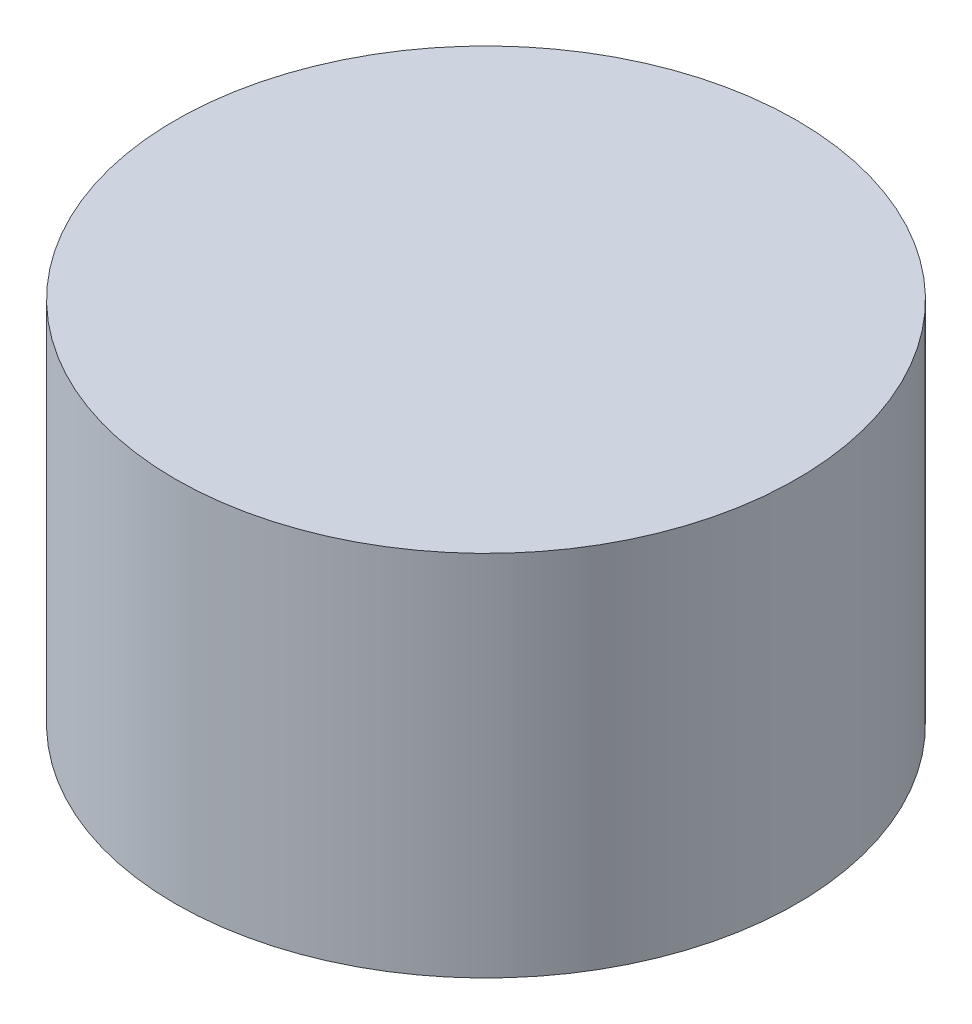
ISO-10303-21;
HEADER;
FILE_DESCRIPTION(('STEP AP214'),'2;1');
FILE_NAME('part.step','',(''),(''),'','','');
FILE_SCHEMA(('AUTOMOTIVE_DESIGN { 1 0 10303 214 1 1 1 1 }'));
ENDSEC;
DATA;
#1=APPLICATION_CONTEXT('core data for automotive mechanical design processes');
#2=APPLICATION_PROTOCOL_DEFINITION('international standard','automotive_design',2000,#1);
#3=PRODUCT_CONTEXT('',#1,'mechanical');
#4=PRODUCT('Part','Part','',(#3));
#5=PRODUCT_RELATED_PRODUCT_CATEGORY('part','',(#4));
#6=PRODUCT_DEFINITION_FORMATION('','',#4);
#7=PRODUCT_DEFINITION_CONTEXT('part definition',#1,'design');
#8=PRODUCT_DEFINITION('design','',#6,#7);
#9=PRODUCT_DEFINITION_SHAPE('','',#8);
#10=(LENGTH_UNIT() NAMED_UNIT(*) SI_UNIT(.MILLI.,.METRE.));
#11=(NAMED_UNIT(*) PLANE_ANGLE_UNIT() SI_UNIT($,.RADIAN.));
#12=(NAMED_UNIT(*) SI_UNIT($,.STERADIAN.) SOLID_ANGLE_UNIT());
#13=UNCERTAINTY_MEASURE_WITH_UNIT(LENGTH_MEASURE(1.E-05),#10,'distance_accuracy_value','');
#14=(GEOMETRIC_REPRESENTATION_CONTEXT(3) GLOBAL_UNCERTAINTY_ASSIGNED_CONTEXT((#13)) GLOBAL_UNIT_ASSIGNED_CONTEXT((#10,
#11,#12)) REPRESENTATION_CONTEXT('',''));
#15=CARTESIAN_POINT('',(0.,0.,0.));
#16=DIRECTION('',(0.,0.,1.));
#17=DIRECTION('',(1.,0.,0.));
#18=AXIS2_PLACEMENT_3D('',#15,#16,#17);
#19=CARTESIAN_POINT('',(-31.573861931133,10.,-9.75152663983241));
#20=DIRECTION('',(0.,-1.,0.));
#21=DIRECTION('',(0.,0.,-1.));
#22=AXIS2_PLACEMENT_3D('',#19,#20,#21);
#23=CYLINDRICAL_SURFACE('',#22,8.45);
#24=CARTESIAN_POINT('',(-31.573861931133,10.,-9.75152663983241));
#25=DIRECTION('',(0.,1.,0.));
#26=DIRECTION('',(0.,0.,1.));
#27=AXIS2_PLACEMENT_3D('',#24,#25,#26);
#28=CIRCLE('',#27,8.45);
#29=CARTESIAN_POINT('',(-31.573861931133,10.,-1.30152663983241));
#30=VERTEX_POINT('',#29);
#31=EDGE_CURVE('E10',#30,#30,#28,.T.);
#32=ORIENTED_EDGE('',*,*,#31,.F.);
#33=EDGE_LOOP('',(#32));
#34=FACE_BOUND('',#33,.T.);
#35=CARTESIAN_POINT('',(-31.573861931133,0.,-9.75152663983241));
#36=DIRECTION('',(0.,1.,0.));
#37=DIRECTION('',(0.,0.,1.));
#38=AXIS2_PLACEMENT_3D('',#35,#36,#37);
#39=CIRCLE('',#38,8.45);
#40=CARTESIAN_POINT('',(-31.573861931133,0.,-1.30152663983241));
#41=VERTEX_POINT('',#40);
#42=EDGE_CURVE('E44',#41,#41,#39,.T.);
#43=ORIENTED_EDGE('',*,*,#42,.T.);
#44=EDGE_LOOP('',(#43));
#45=FACE_BOUND('',#44,.T.);
#46=ADVANCED_FACE('F41',(#34,#45),#23,.T.);
#47=CARTESIAN_POINT('',(-31.573861931133,10.,-9.75152663983241));
#48=DIRECTION('',(0.,1.,0.));
#49=DIRECTION('',(0.,0.,1.));
#50=AXIS2_PLACEMENT_3D('',#47,#48,#49);
#51=PLANE('',#50);
#52=ORIENTED_EDGE('',*,*,#31,.T.);
#53=EDGE_LOOP('',(#52));
#54=FACE_BOUND('',#53,.T.);
#55=ADVANCED_FACE('F58',(#54),#51,.T.);
#56=CARTESIAN_POINT('',(-31.573861931133,0.,-9.75152663983241));
#57=DIRECTION('',(0.,1.,0.));
#58=DIRECTION('',(0.,0.,1.));
#59=AXIS2_PLACEMENT_3D('',#56,#57,#58);
#60=PLANE('',#59);
#61=ORIENTED_EDGE('',*,*,#42,.F.);
#62=EDGE_LOOP('',(#61));
#63=FACE_BOUND('',#62,.T.);
#64=ADVANCED_FACE('F56',(#63),#60,.F.);
#65=CLOSED_SHELL('',(#46,#55,#64));
#66=MANIFOLD_SOLID_BREP('B2',#65);
#67=ADVANCED_BREP_SHAPE_REPRESENTATION('',(#18,#66),#14);
#68=SHAPE_DEFINITION_REPRESENTATION(#9,#67);
ENDSEC;
END-ISO-10303-21;
